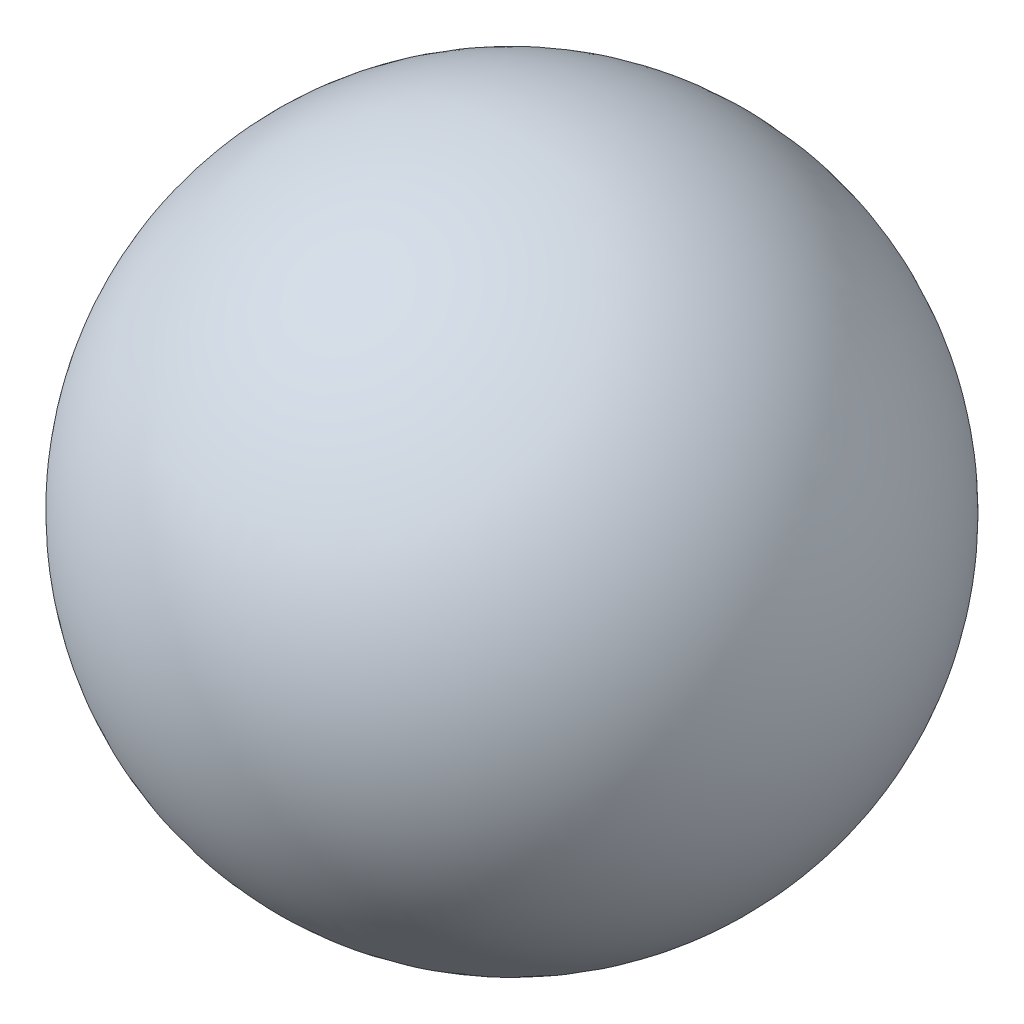
ISO-10303-21;
HEADER;
FILE_DESCRIPTION(('STEP AP214'),'2;1');
FILE_NAME('part.step','',(''),(''),'','','');
FILE_SCHEMA(('AUTOMOTIVE_DESIGN { 1 0 10303 214 1 1 1 1 }'));
ENDSEC;
DATA;
#1=APPLICATION_CONTEXT('core data for automotive mechanical design processes');
#2=APPLICATION_PROTOCOL_DEFINITION('international standard','automotive_design',2000,#1);
#3=PRODUCT_CONTEXT('',#1,'mechanical');
#4=PRODUCT('Part','Part','',(#3));
#5=PRODUCT_RELATED_PRODUCT_CATEGORY('part','',(#4));
#6=PRODUCT_DEFINITION_FORMATION('','',#4);
#7=PRODUCT_DEFINITION_CONTEXT('part definition',#1,'design');
#8=PRODUCT_DEFINITION('design','',#6,#7);
#9=PRODUCT_DEFINITION_SHAPE('','',#8);
#10=(LENGTH_UNIT() NAMED_UNIT(*) SI_UNIT(.MILLI.,.METRE.));
#11=(NAMED_UNIT(*) PLANE_ANGLE_UNIT() SI_UNIT($,.RADIAN.));
#12=(NAMED_UNIT(*) SI_UNIT($,.STERADIAN.) SOLID_ANGLE_UNIT());
#13=UNCERTAINTY_MEASURE_WITH_UNIT(LENGTH_MEASURE(1.E-05),#10,'distance_accuracy_value','');
#14=(GEOMETRIC_REPRESENTATION_CONTEXT(3) GLOBAL_UNCERTAINTY_ASSIGNED_CONTEXT((#13)) GLOBAL_UNIT_ASSIGNED_CONTEXT((#10,
#11,#12)) REPRESENTATION_CONTEXT('',''));
#15=CARTESIAN_POINT('',(0.,0.,0.));
#16=DIRECTION('',(0.,0.,1.));
#17=DIRECTION('',(1.,0.,0.));
#18=AXIS2_PLACEMENT_3D('',#15,#16,#17);
#19=CARTESIAN_POINT('',(0.00198859602395945,0.,-0.355347566485543));
#20=DIRECTION('',(0.,-1.,0.));
#21=DIRECTION('',(-0.00559611229499899,0.,0.999984341640999));
#22=AXIS2_PLACEMENT_3D('',#19,#20,#21);
#23=CIRCLE('',#22,31.75);
#24=TRIMMED_CURVE('',#23,(PARAMETER_VALUE(-1.56520018529107)),
(PARAMETER_VALUE(1.56520018529107)),.T.,.PARAMETER.);
#25=CARTESIAN_POINT('',(0.000994298011980366,0.,-0.177673783242771));
#26=DIRECTION('',(-0.999984341640999,0.,-0.00559611229499899));
#27=AXIS1_PLACEMENT('',#25,#26);
#28=SURFACE_OF_REVOLUTION('',#24,#27);
#29=CARTESIAN_POINT('',(-31.748011403976,0.,-0.355347566485543));
#30=VERTEX_POINT('',#29);
#31=VERTEX_LOOP('',#30);
#32=FACE_BOUND('',#31,.T.);
#33=CARTESIAN_POINT('',(31.75,0.,0.));
#34=VERTEX_POINT('',#33);
#35=VERTEX_LOOP('',#34);
#36=FACE_BOUND('',#35,.T.);
#37=ADVANCED_FACE('F30',(#32,#36),#28,.T.);
#38=CLOSED_SHELL('',(#37));
#39=MANIFOLD_SOLID_BREP('B2',#38);
#40=ADVANCED_BREP_SHAPE_REPRESENTATION('',(#18,#39),#14);
#41=SHAPE_DEFINITION_REPRESENTATION(#9,#40);
ENDSEC;
END-ISO-10303-21;
